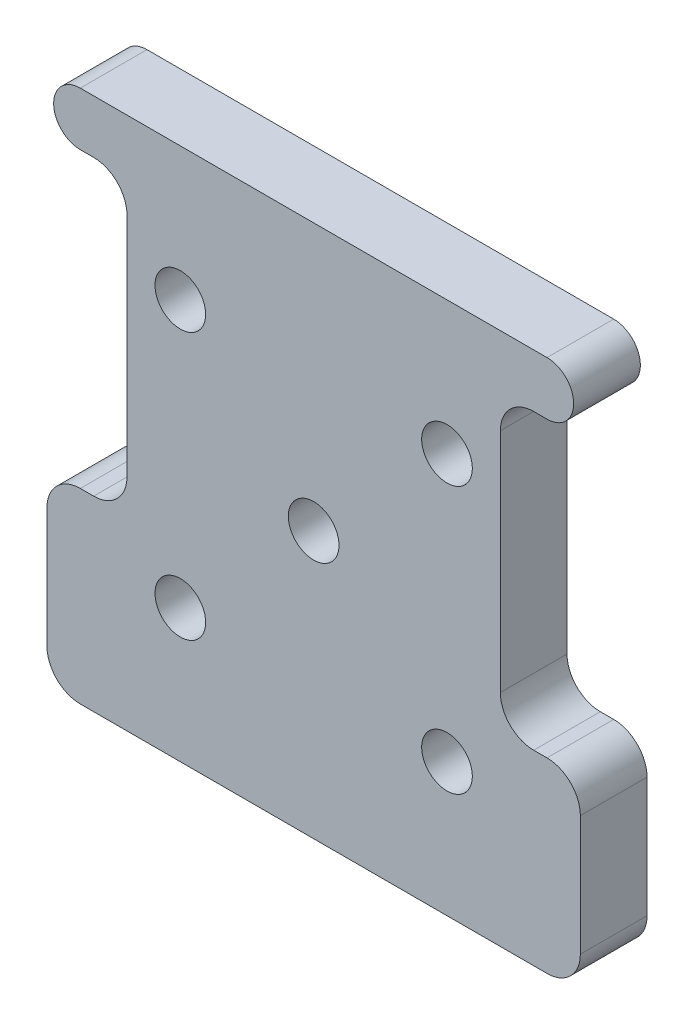
ISO-10303-21;
HEADER;
FILE_DESCRIPTION(('STEP AP214'),'2;1');
FILE_NAME('part.step','',(''),(''),'','','');
FILE_SCHEMA(('AUTOMOTIVE_DESIGN { 1 0 10303 214 1 1 1 1 }'));
ENDSEC;
DATA;
#1=APPLICATION_CONTEXT('core data for automotive mechanical design processes');
#2=APPLICATION_PROTOCOL_DEFINITION('international standard','automotive_design',2000,#1);
#3=PRODUCT_CONTEXT('',#1,'mechanical');
#4=PRODUCT('Part','Part','',(#3));
#5=PRODUCT_RELATED_PRODUCT_CATEGORY('part','',(#4));
#6=PRODUCT_DEFINITION_FORMATION('','',#4);
#7=PRODUCT_DEFINITION_CONTEXT('part definition',#1,'design');
#8=PRODUCT_DEFINITION('design','',#6,#7);
#9=PRODUCT_DEFINITION_SHAPE('','',#8);
#10=(LENGTH_UNIT() NAMED_UNIT(*) SI_UNIT(.MILLI.,.METRE.));
#11=(NAMED_UNIT(*) PLANE_ANGLE_UNIT() SI_UNIT($,.RADIAN.));
#12=(NAMED_UNIT(*) SI_UNIT($,.STERADIAN.) SOLID_ANGLE_UNIT());
#13=UNCERTAINTY_MEASURE_WITH_UNIT(LENGTH_MEASURE(1.E-05),#10,'distance_accuracy_value','');
#14=(GEOMETRIC_REPRESENTATION_CONTEXT(3) GLOBAL_UNCERTAINTY_ASSIGNED_CONTEXT((#13)) GLOBAL_UNIT_ASSIGNED_CONTEXT((#10,
#11,#12)) REPRESENTATION_CONTEXT('',''));
#15=CARTESIAN_POINT('',(0.,0.,0.));
#16=DIRECTION('',(0.,0.,1.));
#17=DIRECTION('',(1.,0.,0.));
#18=AXIS2_PLACEMENT_3D('',#15,#16,#17);
#19=CARTESIAN_POINT('',(0.,0.,6.35));
#20=DIRECTION('',(0.,0.,1.));
#21=DIRECTION('',(1.,0.,0.));
#22=AXIS2_PLACEMENT_3D('',#19,#20,#21);
#23=PLANE('',#22);
#24=CARTESIAN_POINT('',(-12.7,38.1,6.35));
#25=DIRECTION('',(0.,0.,1.));
#26=DIRECTION('',(1.,0.,0.));
#27=AXIS2_PLACEMENT_3D('',#24,#25,#26);
#28=CIRCLE('',#27,2.413);
#29=CARTESIAN_POINT('',(-10.287,38.1,6.35));
#30=VERTEX_POINT('',#29);
#31=EDGE_CURVE('E711',#30,#30,#28,.T.);
#32=ORIENTED_EDGE('',*,*,#31,.F.);
#33=EDGE_LOOP('',(#32));
#34=FACE_BOUND('',#33,.T.);
#35=CARTESIAN_POINT('',(12.7,12.7,6.35));
#36=DIRECTION('',(0.,0.,1.));
#37=DIRECTION('',(1.,0.,0.));
#38=AXIS2_PLACEMENT_3D('',#35,#36,#37);
#39=CIRCLE('',#38,2.413);
#40=CARTESIAN_POINT('',(15.113,12.7,6.35));
#41=VERTEX_POINT('',#40);
#42=EDGE_CURVE('E727',#41,#41,#39,.T.);
#43=ORIENTED_EDGE('',*,*,#42,.F.);
#44=EDGE_LOOP('',(#43));
#45=FACE_BOUND('',#44,.T.);
#46=DIRECTION('',(-1.,0.,0.));
#47=VECTOR('',#46,1.);
#48=CARTESIAN_POINT('',(25.4,50.8,6.35));
#49=LINE('',#48,#47);
#50=CARTESIAN_POINT('',(22.225,50.8,6.35));
#51=VERTEX_POINT('',#50);
#52=CARTESIAN_POINT('',(-22.2250000000001,50.8,6.35));
#53=VERTEX_POINT('',#52);
#54=EDGE_CURVE('E368',#51,#53,#49,.T.);
#55=ORIENTED_EDGE('',*,*,#54,.T.);
#56=CARTESIAN_POINT('',(-22.2250000000002,48.26,6.35));
#57=DIRECTION('',(0.,0.,1.));
#58=DIRECTION('',(1.,0.,0.));
#59=AXIS2_PLACEMENT_3D('',#56,#57,#58);
#60=CIRCLE('',#59,2.54);
#61=CARTESIAN_POINT('',(-22.2250000000002,45.72,6.35));
#62=VERTEX_POINT('',#61);
#63=EDGE_CURVE('E11',#53,#62,#60,.T.);
#64=ORIENTED_EDGE('',*,*,#63,.T.);
#65=DIRECTION('',(1.,0.,0.));
#66=VECTOR('',#65,1.);
#67=CARTESIAN_POINT('',(-17.78,45.72,6.35));
#68=LINE('',#67,#66);
#69=CARTESIAN_POINT('',(-20.955,45.72,6.35));
#70=VERTEX_POINT('',#69);
#71=EDGE_CURVE('E380',#62,#70,#68,.T.);
#72=ORIENTED_EDGE('',*,*,#71,.T.);
#73=CARTESIAN_POINT('',(-20.955,42.545,6.35));
#74=DIRECTION('',(0.,0.,1.));
#75=DIRECTION('',(1.,0.,0.));
#76=AXIS2_PLACEMENT_3D('',#73,#74,#75);
#77=CIRCLE('',#76,3.175);
#78=CARTESIAN_POINT('',(-17.78,42.545,6.35));
#79=VERTEX_POINT('',#78);
#80=EDGE_CURVE('E342',#70,#79,#77,.F.);
#81=ORIENTED_EDGE('',*,*,#80,.T.);
#82=DIRECTION('',(0.,-1.,0.));
#83=VECTOR('',#82,1.);
#84=CARTESIAN_POINT('',(-17.78,17.78,6.35));
#85=LINE('',#84,#83);
#86=CARTESIAN_POINT('',(-17.78,20.955,6.35));
#87=VERTEX_POINT('',#86);
#88=EDGE_CURVE('E424',#79,#87,#85,.T.);
#89=ORIENTED_EDGE('',*,*,#88,.T.);
#90=CARTESIAN_POINT('',(-20.955,20.955,6.35));
#91=DIRECTION('',(0.,0.,1.));
#92=DIRECTION('',(1.,0.,0.));
#93=AXIS2_PLACEMENT_3D('',#90,#91,#92);
#94=CIRCLE('',#93,3.175);
#95=CARTESIAN_POINT('',(-20.955,17.78,6.35));
#96=VERTEX_POINT('',#95);
#97=EDGE_CURVE('E336',#87,#96,#94,.F.);
#98=ORIENTED_EDGE('',*,*,#97,.T.);
#99=DIRECTION('',(-1.,0.,0.));
#100=VECTOR('',#99,1.);
#101=CARTESIAN_POINT('',(-25.4,17.78,6.35));
#102=LINE('',#101,#100);
#103=CARTESIAN_POINT('',(-22.225,17.78,6.35));
#104=VERTEX_POINT('',#103);
#105=EDGE_CURVE('E428',#96,#104,#102,.T.);
#106=ORIENTED_EDGE('',*,*,#105,.T.);
#107=CARTESIAN_POINT('',(-22.225,14.605,6.35));
#108=DIRECTION('',(0.,0.,1.));
#109=DIRECTION('',(1.,0.,0.));
#110=AXIS2_PLACEMENT_3D('',#107,#108,#109);
#111=CIRCLE('',#110,3.175);
#112=CARTESIAN_POINT('',(-25.4,14.605,6.35));
#113=VERTEX_POINT('',#112);
#114=EDGE_CURVE('E62',#104,#113,#111,.T.);
#115=ORIENTED_EDGE('',*,*,#114,.T.);
#116=DIRECTION('',(0.,-1.,0.));
#117=VECTOR('',#116,1.);
#118=CARTESIAN_POINT('',(-25.4,-2.22044604925031E-13,6.35));
#119=LINE('',#118,#117);
#120=CARTESIAN_POINT('',(-25.4,3.17499999999979,6.35));
#121=VERTEX_POINT('',#120);
#122=EDGE_CURVE('E430',#113,#121,#119,.T.);
#123=ORIENTED_EDGE('',*,*,#122,.T.);
#124=CARTESIAN_POINT('',(-22.225,3.17499999999979,6.35));
#125=DIRECTION('',(0.,0.,1.));
#126=DIRECTION('',(1.,0.,0.));
#127=AXIS2_PLACEMENT_3D('',#124,#125,#126);
#128=CIRCLE('',#127,3.175);
#129=CARTESIAN_POINT('',(-22.225,-2.08166817117217E-13,6.35));
#130=VERTEX_POINT('',#129);
#131=EDGE_CURVE('E272',#121,#130,#128,.T.);
#132=ORIENTED_EDGE('',*,*,#131,.T.);
#133=DIRECTION('',(1.,0.,0.));
#134=VECTOR('',#133,1.);
#135=CARTESIAN_POINT('',(-25.4,-2.22044604925031E-13,6.35));
#136=LINE('',#135,#134);
#137=CARTESIAN_POINT('',(22.225,0.,6.35));
#138=VERTEX_POINT('',#137);
#139=EDGE_CURVE('E221',#130,#138,#136,.T.);
#140=ORIENTED_EDGE('',*,*,#139,.T.);
#141=CARTESIAN_POINT('',(22.225,3.17499999999999,6.35));
#142=DIRECTION('',(0.,0.,1.));
#143=DIRECTION('',(1.,0.,0.));
#144=AXIS2_PLACEMENT_3D('',#141,#142,#143);
#145=CIRCLE('',#144,3.175);
#146=CARTESIAN_POINT('',(25.4,3.17499999999999,6.35));
#147=VERTEX_POINT('',#146);
#148=EDGE_CURVE('E275',#138,#147,#145,.T.);
#149=ORIENTED_EDGE('',*,*,#148,.T.);
#150=DIRECTION('',(0.,1.,0.));
#151=VECTOR('',#150,1.);
#152=CARTESIAN_POINT('',(25.4,0.,6.35));
#153=LINE('',#152,#151);
#154=CARTESIAN_POINT('',(25.4,14.605,6.35));
#155=VERTEX_POINT('',#154);
#156=EDGE_CURVE('E199',#147,#155,#153,.T.);
#157=ORIENTED_EDGE('',*,*,#156,.T.);
#158=CARTESIAN_POINT('',(22.225,14.605,6.35));
#159=DIRECTION('',(0.,0.,1.));
#160=DIRECTION('',(1.,0.,0.));
#161=AXIS2_PLACEMENT_3D('',#158,#159,#160);
#162=CIRCLE('',#161,3.175);
#163=CARTESIAN_POINT('',(22.225,17.78,6.35));
#164=VERTEX_POINT('',#163);
#165=EDGE_CURVE('E267',#155,#164,#162,.T.);
#166=ORIENTED_EDGE('',*,*,#165,.T.);
#167=DIRECTION('',(-1.,0.,0.));
#168=VECTOR('',#167,1.);
#169=CARTESIAN_POINT('',(25.4,17.78,6.35));
#170=LINE('',#169,#168);
#171=CARTESIAN_POINT('',(20.955,17.78,6.35));
#172=VERTEX_POINT('',#171);
#173=EDGE_CURVE('E406',#164,#172,#170,.T.);
#174=ORIENTED_EDGE('',*,*,#173,.T.);
#175=CARTESIAN_POINT('',(20.955,20.955,6.35));
#176=DIRECTION('',(0.,0.,1.));
#177=DIRECTION('',(1.,0.,0.));
#178=AXIS2_PLACEMENT_3D('',#175,#176,#177);
#179=CIRCLE('',#178,3.175);
#180=CARTESIAN_POINT('',(17.78,20.955,6.35));
#181=VERTEX_POINT('',#180);
#182=EDGE_CURVE('E354',#172,#181,#179,.F.);
#183=ORIENTED_EDGE('',*,*,#182,.T.);
#184=DIRECTION('',(0.,1.,0.));
#185=VECTOR('',#184,1.);
#186=CARTESIAN_POINT('',(17.78,17.78,6.35));
#187=LINE('',#186,#185);
#188=CARTESIAN_POINT('',(17.78,42.545,6.35));
#189=VERTEX_POINT('',#188);
#190=EDGE_CURVE('E396',#181,#189,#187,.T.);
#191=ORIENTED_EDGE('',*,*,#190,.T.);
#192=CARTESIAN_POINT('',(20.955,42.545,6.35));
#193=DIRECTION('',(0.,0.,1.));
#194=DIRECTION('',(1.,0.,0.));
#195=AXIS2_PLACEMENT_3D('',#192,#193,#194);
#196=CIRCLE('',#195,3.175);
#197=CARTESIAN_POINT('',(20.955,45.72,6.35));
#198=VERTEX_POINT('',#197);
#199=EDGE_CURVE('E348',#189,#198,#196,.F.);
#200=ORIENTED_EDGE('',*,*,#199,.T.);
#201=DIRECTION('',(1.,0.,0.));
#202=VECTOR('',#201,1.);
#203=CARTESIAN_POINT('',(17.78,45.72,6.35));
#204=LINE('',#203,#202);
#205=CARTESIAN_POINT('',(22.225,45.72,6.35));
#206=VERTEX_POINT('',#205);
#207=EDGE_CURVE('E371',#198,#206,#204,.T.);
#208=ORIENTED_EDGE('',*,*,#207,.T.);
#209=CARTESIAN_POINT('',(22.225,48.26,6.35));
#210=DIRECTION('',(0.,0.,1.));
#211=DIRECTION('',(1.,0.,0.));
#212=AXIS2_PLACEMENT_3D('',#209,#210,#211);
#213=CIRCLE('',#212,2.54);
#214=EDGE_CURVE('E48',#206,#51,#213,.T.);
#215=ORIENTED_EDGE('',*,*,#214,.T.);
#216=EDGE_LOOP('',(#55,#64,#72,#81,#89,#98,#106,#115,#123,#132,#140,#149,#157,#166,#174,#183,
#191,#200,#208,#215));
#217=FACE_BOUND('',#216,.T.);
#218=CARTESIAN_POINT('',(-12.7,12.7,6.35));
#219=DIRECTION('',(0.,0.,1.));
#220=DIRECTION('',(1.,0.,0.));
#221=AXIS2_PLACEMENT_3D('',#218,#219,#220);
#222=CIRCLE('',#221,2.413);
#223=CARTESIAN_POINT('',(-10.287,12.7,6.35));
#224=VERTEX_POINT('',#223);
#225=EDGE_CURVE('E210',#224,#224,#222,.T.);
#226=ORIENTED_EDGE('',*,*,#225,.F.);
#227=EDGE_LOOP('',(#226));
#228=FACE_BOUND('',#227,.T.);
#229=CARTESIAN_POINT('',(0.,25.4,6.35));
#230=DIRECTION('',(0.,0.,1.));
#231=DIRECTION('',(1.,0.,0.));
#232=AXIS2_PLACEMENT_3D('',#229,#230,#231);
#233=CIRCLE('',#232,2.413);
#234=CARTESIAN_POINT('',(2.413,25.4,6.35));
#235=VERTEX_POINT('',#234);
#236=EDGE_CURVE('E719',#235,#235,#233,.T.);
#237=ORIENTED_EDGE('',*,*,#236,.F.);
#238=EDGE_LOOP('',(#237));
#239=FACE_BOUND('',#238,.T.);
#240=CARTESIAN_POINT('',(12.7,38.1,6.35));
#241=DIRECTION('',(0.,0.,1.));
#242=DIRECTION('',(1.,0.,0.));
#243=AXIS2_PLACEMENT_3D('',#240,#241,#242);
#244=CIRCLE('',#243,2.413);
#245=CARTESIAN_POINT('',(15.113,38.1,6.35));
#246=VERTEX_POINT('',#245);
#247=EDGE_CURVE('E700',#246,#246,#244,.T.);
#248=ORIENTED_EDGE('',*,*,#247,.F.);
#249=EDGE_LOOP('',(#248));
#250=FACE_BOUND('',#249,.T.);
#251=ADVANCED_FACE('F39',(#34,#45,#217,#228,#239,#250),#23,.T.);
#252=CARTESIAN_POINT('',(0.,0.,0.));
#253=DIRECTION('',(0.,0.,1.));
#254=DIRECTION('',(1.,0.,0.));
#255=AXIS2_PLACEMENT_3D('',#252,#253,#254);
#256=PLANE('',#255);
#257=DIRECTION('',(1.,0.,0.));
#258=VECTOR('',#257,1.);
#259=CARTESIAN_POINT('',(-17.78,45.72,0.));
#260=LINE('',#259,#258);
#261=CARTESIAN_POINT('',(-22.2250000000002,45.72,0.));
#262=VERTEX_POINT('',#261);
#263=CARTESIAN_POINT('',(-20.955,45.72,0.));
#264=VERTEX_POINT('',#263);
#265=EDGE_CURVE('E235',#262,#264,#260,.T.);
#266=ORIENTED_EDGE('',*,*,#265,.F.);
#267=CARTESIAN_POINT('',(-22.2250000000002,48.26,0.));
#268=DIRECTION('',(0.,0.,1.));
#269=DIRECTION('',(1.,0.,0.));
#270=AXIS2_PLACEMENT_3D('',#267,#268,#269);
#271=CIRCLE('',#270,2.54);
#272=CARTESIAN_POINT('',(-22.2250000000001,50.8,0.));
#273=VERTEX_POINT('',#272);
#274=EDGE_CURVE('E360',#262,#273,#271,.F.);
#275=ORIENTED_EDGE('',*,*,#274,.T.);
#276=DIRECTION('',(-1.,0.,0.));
#277=VECTOR('',#276,1.);
#278=CARTESIAN_POINT('',(25.4,50.8,0.));
#279=LINE('',#278,#277);
#280=CARTESIAN_POINT('',(22.225,50.8,0.));
#281=VERTEX_POINT('',#280);
#282=EDGE_CURVE('E231',#281,#273,#279,.T.);
#283=ORIENTED_EDGE('',*,*,#282,.F.);
#284=CARTESIAN_POINT('',(22.225,48.26,0.));
#285=DIRECTION('',(0.,0.,1.));
#286=DIRECTION('',(1.,0.,0.));
#287=AXIS2_PLACEMENT_3D('',#284,#285,#286);
#288=CIRCLE('',#287,2.54);
#289=CARTESIAN_POINT('',(22.225,45.72,0.));
#290=VERTEX_POINT('',#289);
#291=EDGE_CURVE('E357',#281,#290,#288,.F.);
#292=ORIENTED_EDGE('',*,*,#291,.T.);
#293=DIRECTION('',(1.,0.,0.));
#294=VECTOR('',#293,1.);
#295=CARTESIAN_POINT('',(17.78,45.72,0.));
#296=LINE('',#295,#294);
#297=CARTESIAN_POINT('',(20.955,45.72,0.));
#298=VERTEX_POINT('',#297);
#299=EDGE_CURVE('E227',#298,#290,#296,.T.);
#300=ORIENTED_EDGE('',*,*,#299,.F.);
#301=CARTESIAN_POINT('',(20.955,42.545,0.));
#302=DIRECTION('',(0.,0.,1.));
#303=DIRECTION('',(1.,0.,0.));
#304=AXIS2_PLACEMENT_3D('',#301,#302,#303);
#305=CIRCLE('',#304,3.175);
#306=CARTESIAN_POINT('',(17.78,42.545,0.));
#307=VERTEX_POINT('',#306);
#308=EDGE_CURVE('E345',#298,#307,#305,.T.);
#309=ORIENTED_EDGE('',*,*,#308,.T.);
#310=DIRECTION('',(0.,1.,0.));
#311=VECTOR('',#310,1.);
#312=CARTESIAN_POINT('',(17.78,17.78,0.));
#313=LINE('',#312,#311);
#314=CARTESIAN_POINT('',(17.78,20.955,0.));
#315=VERTEX_POINT('',#314);
#316=EDGE_CURVE('E215',#315,#307,#313,.T.);
#317=ORIENTED_EDGE('',*,*,#316,.F.);
#318=CARTESIAN_POINT('',(20.955,20.955,0.));
#319=DIRECTION('',(0.,0.,1.));
#320=DIRECTION('',(1.,0.,0.));
#321=AXIS2_PLACEMENT_3D('',#318,#319,#320);
#322=CIRCLE('',#321,3.175);
#323=CARTESIAN_POINT('',(20.955,17.78,0.));
#324=VERTEX_POINT('',#323);
#325=EDGE_CURVE('E351',#315,#324,#322,.T.);
#326=ORIENTED_EDGE('',*,*,#325,.T.);
#327=DIRECTION('',(-1.,0.,0.));
#328=VECTOR('',#327,1.);
#329=CARTESIAN_POINT('',(25.4,17.78,0.));
#330=LINE('',#329,#328);
#331=CARTESIAN_POINT('',(22.225,17.78,0.));
#332=VERTEX_POINT('',#331);
#333=EDGE_CURVE('E209',#332,#324,#330,.T.);
#334=ORIENTED_EDGE('',*,*,#333,.F.);
#335=CARTESIAN_POINT('',(22.225,14.605,0.));
#336=DIRECTION('',(0.,0.,1.));
#337=DIRECTION('',(1.,0.,0.));
#338=AXIS2_PLACEMENT_3D('',#335,#336,#337);
#339=CIRCLE('',#338,3.175);
#340=CARTESIAN_POINT('',(25.4,14.605,0.));
#341=VERTEX_POINT('',#340);
#342=EDGE_CURVE('E201',#332,#341,#339,.F.);
#343=ORIENTED_EDGE('',*,*,#342,.T.);
#344=DIRECTION('',(0.,1.,0.));
#345=VECTOR('',#344,1.);
#346=CARTESIAN_POINT('',(25.4,0.,0.));
#347=LINE('',#346,#345);
#348=CARTESIAN_POINT('',(25.4,3.17499999999999,0.));
#349=VERTEX_POINT('',#348);
#350=EDGE_CURVE('E196',#349,#341,#347,.T.);
#351=ORIENTED_EDGE('',*,*,#350,.F.);
#352=CARTESIAN_POINT('',(22.225,3.17499999999999,0.));
#353=DIRECTION('',(0.,0.,1.));
#354=DIRECTION('',(1.,0.,0.));
#355=AXIS2_PLACEMENT_3D('',#352,#353,#354);
#356=CIRCLE('',#355,3.175);
#357=CARTESIAN_POINT('',(22.225,0.,0.));
#358=VERTEX_POINT('',#357);
#359=EDGE_CURVE('E178',#349,#358,#356,.F.);
#360=ORIENTED_EDGE('',*,*,#359,.T.);
#361=DIRECTION('',(1.,0.,0.));
#362=VECTOR('',#361,1.);
#363=CARTESIAN_POINT('',(-25.4,-2.22044604925031E-13,0.));
#364=LINE('',#363,#362);
#365=CARTESIAN_POINT('',(-22.225,-2.08166817117217E-13,0.));
#366=VERTEX_POINT('',#365);
#367=EDGE_CURVE('E250',#366,#358,#364,.T.);
#368=ORIENTED_EDGE('',*,*,#367,.F.);
#369=CARTESIAN_POINT('',(-22.225,3.17499999999979,0.));
#370=DIRECTION('',(0.,0.,1.));
#371=DIRECTION('',(1.,0.,0.));
#372=AXIS2_PLACEMENT_3D('',#369,#370,#371);
#373=CIRCLE('',#372,3.175);
#374=CARTESIAN_POINT('',(-25.4,3.17499999999979,0.));
#375=VERTEX_POINT('',#374);
#376=EDGE_CURVE('E190',#366,#375,#373,.F.);
#377=ORIENTED_EDGE('',*,*,#376,.T.);
#378=DIRECTION('',(0.,-1.,0.));
#379=VECTOR('',#378,1.);
#380=CARTESIAN_POINT('',(-25.4,-2.22044604925031E-13,0.));
#381=LINE('',#380,#379);
#382=CARTESIAN_POINT('',(-25.4,14.605,0.));
#383=VERTEX_POINT('',#382);
#384=EDGE_CURVE('E247',#383,#375,#381,.T.);
#385=ORIENTED_EDGE('',*,*,#384,.F.);
#386=CARTESIAN_POINT('',(-22.225,14.605,0.));
#387=DIRECTION('',(0.,0.,1.));
#388=DIRECTION('',(1.,0.,0.));
#389=AXIS2_PLACEMENT_3D('',#386,#387,#388);
#390=CIRCLE('',#389,3.175);
#391=CARTESIAN_POINT('',(-22.225,17.78,0.));
#392=VERTEX_POINT('',#391);
#393=EDGE_CURVE('E257',#383,#392,#390,.F.);
#394=ORIENTED_EDGE('',*,*,#393,.T.);
#395=DIRECTION('',(-1.,0.,0.));
#396=VECTOR('',#395,1.);
#397=CARTESIAN_POINT('',(-25.4,17.78,0.));
#398=LINE('',#397,#396);
#399=CARTESIAN_POINT('',(-20.955,17.78,0.));
#400=VERTEX_POINT('',#399);
#401=EDGE_CURVE('E243',#400,#392,#398,.T.);
#402=ORIENTED_EDGE('',*,*,#401,.F.);
#403=CARTESIAN_POINT('',(-20.955,20.955,0.));
#404=DIRECTION('',(0.,0.,1.));
#405=DIRECTION('',(1.,0.,0.));
#406=AXIS2_PLACEMENT_3D('',#403,#404,#405);
#407=CIRCLE('',#406,3.175);
#408=CARTESIAN_POINT('',(-17.78,20.955,0.));
#409=VERTEX_POINT('',#408);
#410=EDGE_CURVE('E333',#400,#409,#407,.T.);
#411=ORIENTED_EDGE('',*,*,#410,.T.);
#412=DIRECTION('',(0.,-1.,0.));
#413=VECTOR('',#412,1.);
#414=CARTESIAN_POINT('',(-17.78,17.78,0.));
#415=LINE('',#414,#413);
#416=CARTESIAN_POINT('',(-17.78,42.545,0.));
#417=VERTEX_POINT('',#416);
#418=EDGE_CURVE('E239',#417,#409,#415,.T.);
#419=ORIENTED_EDGE('',*,*,#418,.F.);
#420=CARTESIAN_POINT('',(-20.955,42.545,0.));
#421=DIRECTION('',(0.,0.,1.));
#422=DIRECTION('',(1.,0.,0.));
#423=AXIS2_PLACEMENT_3D('',#420,#421,#422);
#424=CIRCLE('',#423,3.175);
#425=EDGE_CURVE('E339',#417,#264,#424,.T.);
#426=ORIENTED_EDGE('',*,*,#425,.T.);
#427=EDGE_LOOP('',(#266,#275,#283,#292,#300,#309,#317,#326,#334,#343,#351,#360,#368,#377,#385,
#394,#402,#411,#419,#426));
#428=FACE_BOUND('',#427,.T.);
#429=CARTESIAN_POINT('',(-12.7,12.7,0.));
#430=DIRECTION('',(0.,0.,1.));
#431=DIRECTION('',(1.,0.,0.));
#432=AXIS2_PLACEMENT_3D('',#429,#430,#431);
#433=CIRCLE('',#432,2.413);
#434=CARTESIAN_POINT('',(-10.287,12.7,0.));
#435=VERTEX_POINT('',#434);
#436=EDGE_CURVE('E218',#435,#435,#433,.T.);
#437=ORIENTED_EDGE('',*,*,#436,.T.);
#438=EDGE_LOOP('',(#437));
#439=FACE_BOUND('',#438,.T.);
#440=CARTESIAN_POINT('',(12.7,12.7,0.));
#441=DIRECTION('',(0.,0.,1.));
#442=DIRECTION('',(1.,0.,0.));
#443=AXIS2_PLACEMENT_3D('',#440,#441,#442);
#444=CIRCLE('',#443,2.413);
#445=CARTESIAN_POINT('',(15.113,12.7,0.));
#446=VERTEX_POINT('',#445);
#447=EDGE_CURVE('E723',#446,#446,#444,.T.);
#448=ORIENTED_EDGE('',*,*,#447,.T.);
#449=EDGE_LOOP('',(#448));
#450=FACE_BOUND('',#449,.T.);
#451=CARTESIAN_POINT('',(0.,25.4,0.));
#452=DIRECTION('',(0.,0.,1.));
#453=DIRECTION('',(1.,0.,0.));
#454=AXIS2_PLACEMENT_3D('',#451,#452,#453);
#455=CIRCLE('',#454,2.413);
#456=CARTESIAN_POINT('',(2.413,25.4,0.));
#457=VERTEX_POINT('',#456);
#458=EDGE_CURVE('E715',#457,#457,#455,.T.);
#459=ORIENTED_EDGE('',*,*,#458,.T.);
#460=EDGE_LOOP('',(#459));
#461=FACE_BOUND('',#460,.T.);
#462=CARTESIAN_POINT('',(-12.7,38.1,0.));
#463=DIRECTION('',(0.,0.,1.));
#464=DIRECTION('',(1.,0.,0.));
#465=AXIS2_PLACEMENT_3D('',#462,#463,#464);
#466=CIRCLE('',#465,2.413);
#467=CARTESIAN_POINT('',(-10.287,38.1,0.));
#468=VERTEX_POINT('',#467);
#469=EDGE_CURVE('E708',#468,#468,#466,.T.);
#470=ORIENTED_EDGE('',*,*,#469,.T.);
#471=EDGE_LOOP('',(#470));
#472=FACE_BOUND('',#471,.T.);
#473=CARTESIAN_POINT('',(12.7,38.1,0.));
#474=DIRECTION('',(0.,0.,1.));
#475=DIRECTION('',(1.,0.,0.));
#476=AXIS2_PLACEMENT_3D('',#473,#474,#475);
#477=CIRCLE('',#476,2.413);
#478=CARTESIAN_POINT('',(15.113,38.1,0.));
#479=VERTEX_POINT('',#478);
#480=EDGE_CURVE('E703',#479,#479,#477,.T.);
#481=ORIENTED_EDGE('',*,*,#480,.T.);
#482=EDGE_LOOP('',(#481));
#483=FACE_BOUND('',#482,.T.);
#484=ADVANCED_FACE('F205',(#428,#439,#450,#461,#472,#483),#256,.F.);
#485=CARTESIAN_POINT('',(25.4,0.,6.35));
#486=DIRECTION('',(-1.,0.,0.));
#487=DIRECTION('',(0.,0.,1.));
#488=AXIS2_PLACEMENT_3D('',#485,#486,#487);
#489=PLANE('',#488);
#490=ORIENTED_EDGE('',*,*,#156,.F.);
#491=DIRECTION('',(0.,0.,-1.));
#492=VECTOR('',#491,1.);
#493=CARTESIAN_POINT('',(25.4,3.17499999999999,6.35));
#494=LINE('',#493,#492);
#495=EDGE_CURVE('E182',#147,#349,#494,.T.);
#496=ORIENTED_EDGE('',*,*,#495,.T.);
#497=ORIENTED_EDGE('',*,*,#350,.T.);
#498=DIRECTION('',(0.,0.,-1.));
#499=VECTOR('',#498,1.);
#500=CARTESIAN_POINT('',(25.4,14.605,6.35));
#501=LINE('',#500,#499);
#502=EDGE_CURVE('E202',#341,#155,#501,.F.);
#503=ORIENTED_EDGE('',*,*,#502,.T.);
#504=EDGE_LOOP('',(#490,#496,#497,#503));
#505=FACE_BOUND('',#504,.T.);
#506=ADVANCED_FACE('F195',(#505),#489,.F.);
#507=CARTESIAN_POINT('',(25.4,17.78,6.35));
#508=DIRECTION('',(0.,-1.,0.));
#509=DIRECTION('',(0.,0.,-1.));
#510=AXIS2_PLACEMENT_3D('',#507,#508,#509);
#511=PLANE('',#510);
#512=ORIENTED_EDGE('',*,*,#333,.T.);
#513=DIRECTION('',(0.,0.,-1.));
#514=VECTOR('',#513,1.);
#515=CARTESIAN_POINT('',(20.955,17.78,6.35));
#516=LINE('',#515,#514);
#517=EDGE_CURVE('E330',#324,#172,#516,.F.);
#518=ORIENTED_EDGE('',*,*,#517,.T.);
#519=ORIENTED_EDGE('',*,*,#173,.F.);
#520=DIRECTION('',(0.,0.,-1.));
#521=VECTOR('',#520,1.);
#522=CARTESIAN_POINT('',(22.225,17.78,6.35));
#523=LINE('',#522,#521);
#524=EDGE_CURVE('E326',#164,#332,#523,.T.);
#525=ORIENTED_EDGE('',*,*,#524,.T.);
#526=EDGE_LOOP('',(#512,#518,#519,#525));
#527=FACE_BOUND('',#526,.T.);
#528=ADVANCED_FACE('F402',(#527),#511,.F.);
#529=CARTESIAN_POINT('',(17.78,17.78,6.35));
#530=DIRECTION('',(-1.,0.,0.));
#531=DIRECTION('',(0.,0.,1.));
#532=AXIS2_PLACEMENT_3D('',#529,#530,#531);
#533=PLANE('',#532);
#534=ORIENTED_EDGE('',*,*,#316,.T.);
#535=DIRECTION('',(0.,0.,-1.));
#536=VECTOR('',#535,1.);
#537=CARTESIAN_POINT('',(17.78,42.545,6.35));
#538=LINE('',#537,#536);
#539=EDGE_CURVE('E323',#307,#189,#538,.F.);
#540=ORIENTED_EDGE('',*,*,#539,.T.);
#541=ORIENTED_EDGE('',*,*,#190,.F.);
#542=DIRECTION('',(0.,0.,-1.));
#543=VECTOR('',#542,1.);
#544=CARTESIAN_POINT('',(17.78,20.955,0.));
#545=LINE('',#544,#543);
#546=EDGE_CURVE('E319',#181,#315,#545,.T.);
#547=ORIENTED_EDGE('',*,*,#546,.T.);
#548=EDGE_LOOP('',(#534,#540,#541,#547));
#549=FACE_BOUND('',#548,.T.);
#550=ADVANCED_FACE('F392',(#549),#533,.F.);
#551=CARTESIAN_POINT('',(17.78,45.72,6.35));
#552=DIRECTION('',(0.,1.,0.));
#553=DIRECTION('',(0.,0.,1.));
#554=AXIS2_PLACEMENT_3D('',#551,#552,#553);
#555=PLANE('',#554);
#556=ORIENTED_EDGE('',*,*,#299,.T.);
#557=DIRECTION('',(0.,0.,-1.));
#558=VECTOR('',#557,1.);
#559=CARTESIAN_POINT('',(22.225,45.72,6.35));
#560=LINE('',#559,#558);
#561=EDGE_CURVE('E316',#290,#206,#560,.F.);
#562=ORIENTED_EDGE('',*,*,#561,.T.);
#563=ORIENTED_EDGE('',*,*,#207,.F.);
#564=DIRECTION('',(0.,0.,-1.));
#565=VECTOR('',#564,1.);
#566=CARTESIAN_POINT('',(20.955,45.72,0.));
#567=LINE('',#566,#565);
#568=EDGE_CURVE('E312',#198,#298,#567,.T.);
#569=ORIENTED_EDGE('',*,*,#568,.T.);
#570=EDGE_LOOP('',(#556,#562,#563,#569));
#571=FACE_BOUND('',#570,.T.);
#572=ADVANCED_FACE('F384',(#571),#555,.F.);
#573=CARTESIAN_POINT('',(25.4,50.8,6.35));
#574=DIRECTION('',(0.,-1.,0.));
#575=DIRECTION('',(0.,0.,-1.));
#576=AXIS2_PLACEMENT_3D('',#573,#574,#575);
#577=PLANE('',#576);
#578=ORIENTED_EDGE('',*,*,#54,.F.);
#579=DIRECTION('',(0.,0.,-1.));
#580=VECTOR('',#579,1.);
#581=CARTESIAN_POINT('',(22.225,50.8,6.35));
#582=LINE('',#581,#580);
#583=EDGE_CURVE('E308',#51,#281,#582,.T.);
#584=ORIENTED_EDGE('',*,*,#583,.T.);
#585=ORIENTED_EDGE('',*,*,#282,.T.);
#586=DIRECTION('',(0.,0.,-1.));
#587=VECTOR('',#586,1.);
#588=CARTESIAN_POINT('',(-22.2250000000001,50.8,6.35));
#589=LINE('',#588,#587);
#590=EDGE_CURVE('E305',#273,#53,#589,.F.);
#591=ORIENTED_EDGE('',*,*,#590,.T.);
#592=EDGE_LOOP('',(#578,#584,#585,#591));
#593=FACE_BOUND('',#592,.T.);
#594=ADVANCED_FACE('F376',(#593),#577,.F.);
#595=CARTESIAN_POINT('',(-17.78,45.72,6.35));
#596=DIRECTION('',(0.,1.,0.));
#597=DIRECTION('',(0.,0.,1.));
#598=AXIS2_PLACEMENT_3D('',#595,#596,#597);
#599=PLANE('',#598);
#600=ORIENTED_EDGE('',*,*,#265,.T.);
#601=DIRECTION('',(0.,0.,-1.));
#602=VECTOR('',#601,1.);
#603=CARTESIAN_POINT('',(-20.955,45.72,6.35));
#604=LINE('',#603,#602);
#605=EDGE_CURVE('E302',#264,#70,#604,.F.);
#606=ORIENTED_EDGE('',*,*,#605,.T.);
#607=ORIENTED_EDGE('',*,*,#71,.F.);
#608=DIRECTION('',(0.,0.,-1.));
#609=VECTOR('',#608,1.);
#610=CARTESIAN_POINT('',(-22.2250000000002,45.72,6.35));
#611=LINE('',#610,#609);
#612=EDGE_CURVE('E298',#62,#262,#611,.T.);
#613=ORIENTED_EDGE('',*,*,#612,.T.);
#614=EDGE_LOOP('',(#600,#606,#607,#613));
#615=FACE_BOUND('',#614,.T.);
#616=ADVANCED_FACE('F465',(#615),#599,.F.);
#617=CARTESIAN_POINT('',(-17.78,17.78,6.35));
#618=DIRECTION('',(1.,0.,0.));
#619=DIRECTION('',(0.,0.,-1.));
#620=AXIS2_PLACEMENT_3D('',#617,#618,#619);
#621=PLANE('',#620);
#622=ORIENTED_EDGE('',*,*,#418,.T.);
#623=DIRECTION('',(0.,0.,-1.));
#624=VECTOR('',#623,1.);
#625=CARTESIAN_POINT('',(-17.78,20.955,6.35));
#626=LINE('',#625,#624);
#627=EDGE_CURVE('E295',#409,#87,#626,.F.);
#628=ORIENTED_EDGE('',*,*,#627,.T.);
#629=ORIENTED_EDGE('',*,*,#88,.F.);
#630=DIRECTION('',(0.,0.,-1.));
#631=VECTOR('',#630,1.);
#632=CARTESIAN_POINT('',(-17.78,42.545,0.));
#633=LINE('',#632,#631);
#634=EDGE_CURVE('E291',#79,#417,#633,.T.);
#635=ORIENTED_EDGE('',*,*,#634,.T.);
#636=EDGE_LOOP('',(#622,#628,#629,#635));
#637=FACE_BOUND('',#636,.T.);
#638=ADVANCED_FACE('F457',(#637),#621,.F.);
#639=CARTESIAN_POINT('',(-25.4,17.78,6.35));
#640=DIRECTION('',(0.,-1.,0.));
#641=DIRECTION('',(0.,0.,-1.));
#642=AXIS2_PLACEMENT_3D('',#639,#640,#641);
#643=PLANE('',#642);
#644=ORIENTED_EDGE('',*,*,#401,.T.);
#645=DIRECTION('',(0.,0.,-1.));
#646=VECTOR('',#645,1.);
#647=CARTESIAN_POINT('',(-22.225,17.78,6.35));
#648=LINE('',#647,#646);
#649=EDGE_CURVE('E288',#392,#104,#648,.F.);
#650=ORIENTED_EDGE('',*,*,#649,.T.);
#651=ORIENTED_EDGE('',*,*,#105,.F.);
#652=DIRECTION('',(0.,0.,-1.));
#653=VECTOR('',#652,1.);
#654=CARTESIAN_POINT('',(-20.955,17.78,0.));
#655=LINE('',#654,#653);
#656=EDGE_CURVE('E284',#96,#400,#655,.T.);
#657=ORIENTED_EDGE('',*,*,#656,.T.);
#658=EDGE_LOOP('',(#644,#650,#651,#657));
#659=FACE_BOUND('',#658,.T.);
#660=ADVANCED_FACE('F448',(#659),#643,.F.);
#661=CARTESIAN_POINT('',(-25.4,-2.22044604925031E-13,6.35));
#662=DIRECTION('',(1.,0.,0.));
#663=DIRECTION('',(0.,0.,-1.));
#664=AXIS2_PLACEMENT_3D('',#661,#662,#663);
#665=PLANE('',#664);
#666=ORIENTED_EDGE('',*,*,#384,.T.);
#667=DIRECTION('',(0.,0.,-1.));
#668=VECTOR('',#667,1.);
#669=CARTESIAN_POINT('',(-25.4,3.17499999999979,6.35));
#670=LINE('',#669,#668);
#671=EDGE_CURVE('E55',#375,#121,#670,.F.);
#672=ORIENTED_EDGE('',*,*,#671,.T.);
#673=ORIENTED_EDGE('',*,*,#122,.F.);
#674=DIRECTION('',(0.,0.,-1.));
#675=VECTOR('',#674,1.);
#676=CARTESIAN_POINT('',(-25.4,14.605,6.35));
#677=LINE('',#676,#675);
#678=EDGE_CURVE('E278',#113,#383,#677,.T.);
#679=ORIENTED_EDGE('',*,*,#678,.T.);
#680=EDGE_LOOP('',(#666,#672,#673,#679));
#681=FACE_BOUND('',#680,.T.);
#682=ADVANCED_FACE('F441',(#681),#665,.F.);
#683=CARTESIAN_POINT('',(-25.4,-2.22044604925031E-13,6.35));
#684=DIRECTION('',(0.,1.,0.));
#685=DIRECTION('',(-1.,0.,0.));
#686=AXIS2_PLACEMENT_3D('',#683,#684,#685);
#687=PLANE('',#686);
#688=ORIENTED_EDGE('',*,*,#367,.T.);
#689=DIRECTION('',(0.,0.,-1.));
#690=VECTOR('',#689,1.);
#691=CARTESIAN_POINT('',(22.225,0.,6.35));
#692=LINE('',#691,#690);
#693=EDGE_CURVE('E183',#358,#138,#692,.F.);
#694=ORIENTED_EDGE('',*,*,#693,.T.);
#695=ORIENTED_EDGE('',*,*,#139,.F.);
#696=DIRECTION('',(0.,0.,-1.));
#697=VECTOR('',#696,1.);
#698=CARTESIAN_POINT('',(-22.225,-2.08166817117217E-13,6.35));
#699=LINE('',#698,#697);
#700=EDGE_CURVE('E189',#130,#366,#699,.T.);
#701=ORIENTED_EDGE('',*,*,#700,.T.);
#702=EDGE_LOOP('',(#688,#694,#695,#701));
#703=FACE_BOUND('',#702,.T.);
#704=ADVANCED_FACE('F437',(#703),#687,.F.);
#705=CARTESIAN_POINT('',(-12.7,12.7,6.35));
#706=DIRECTION('',(0.,0.,-1.));
#707=DIRECTION('',(-1.,0.,0.));
#708=AXIS2_PLACEMENT_3D('',#705,#706,#707);
#709=CYLINDRICAL_SURFACE('',#708,2.413);
#710=ORIENTED_EDGE('',*,*,#225,.T.);
#711=EDGE_LOOP('',(#710));
#712=FACE_BOUND('',#711,.T.);
#713=ORIENTED_EDGE('',*,*,#436,.F.);
#714=EDGE_LOOP('',(#713));
#715=FACE_BOUND('',#714,.T.);
#716=ADVANCED_FACE('F486',(#712,#715),#709,.F.);
#717=CARTESIAN_POINT('',(12.7,12.7,6.35));
#718=DIRECTION('',(0.,0.,-1.));
#719=DIRECTION('',(-1.,0.,0.));
#720=AXIS2_PLACEMENT_3D('',#717,#718,#719);
#721=CYLINDRICAL_SURFACE('',#720,2.413);
#722=ORIENTED_EDGE('',*,*,#42,.T.);
#723=EDGE_LOOP('',(#722));
#724=FACE_BOUND('',#723,.T.);
#725=ORIENTED_EDGE('',*,*,#447,.F.);
#726=EDGE_LOOP('',(#725));
#727=FACE_BOUND('',#726,.T.);
#728=ADVANCED_FACE('F597',(#724,#727),#721,.F.);
#729=CARTESIAN_POINT('',(0.,25.4,6.35));
#730=DIRECTION('',(0.,0.,-1.));
#731=DIRECTION('',(-1.,0.,0.));
#732=AXIS2_PLACEMENT_3D('',#729,#730,#731);
#733=CYLINDRICAL_SURFACE('',#732,2.413);
#734=ORIENTED_EDGE('',*,*,#236,.T.);
#735=EDGE_LOOP('',(#734));
#736=FACE_BOUND('',#735,.T.);
#737=ORIENTED_EDGE('',*,*,#458,.F.);
#738=EDGE_LOOP('',(#737));
#739=FACE_BOUND('',#738,.T.);
#740=ADVANCED_FACE('F604',(#736,#739),#733,.F.);
#741=CARTESIAN_POINT('',(-12.7,38.1,6.35));
#742=DIRECTION('',(0.,0.,-1.));
#743=DIRECTION('',(-1.,0.,0.));
#744=AXIS2_PLACEMENT_3D('',#741,#742,#743);
#745=CYLINDRICAL_SURFACE('',#744,2.413);
#746=ORIENTED_EDGE('',*,*,#31,.T.);
#747=EDGE_LOOP('',(#746));
#748=FACE_BOUND('',#747,.T.);
#749=ORIENTED_EDGE('',*,*,#469,.F.);
#750=EDGE_LOOP('',(#749));
#751=FACE_BOUND('',#750,.T.);
#752=ADVANCED_FACE('F611',(#748,#751),#745,.F.);
#753=CARTESIAN_POINT('',(12.7,38.1,6.35));
#754=DIRECTION('',(0.,0.,-1.));
#755=DIRECTION('',(-1.,0.,0.));
#756=AXIS2_PLACEMENT_3D('',#753,#754,#755);
#757=CYLINDRICAL_SURFACE('',#756,2.413);
#758=ORIENTED_EDGE('',*,*,#247,.T.);
#759=EDGE_LOOP('',(#758));
#760=FACE_BOUND('',#759,.T.);
#761=ORIENTED_EDGE('',*,*,#480,.F.);
#762=EDGE_LOOP('',(#761));
#763=FACE_BOUND('',#762,.T.);
#764=ADVANCED_FACE('F511',(#760,#763),#757,.F.);
#765=CARTESIAN_POINT('',(22.225,3.17499999999999,6.35));
#766=DIRECTION('',(0.,0.,-1.));
#767=DIRECTION('',(-1.,0.,0.));
#768=AXIS2_PLACEMENT_3D('',#765,#766,#767);
#769=CYLINDRICAL_SURFACE('',#768,3.175);
#770=ORIENTED_EDGE('',*,*,#148,.F.);
#771=ORIENTED_EDGE('',*,*,#693,.F.);
#772=ORIENTED_EDGE('',*,*,#359,.F.);
#773=ORIENTED_EDGE('',*,*,#495,.F.);
#774=EDGE_LOOP('',(#770,#771,#772,#773));
#775=FACE_BOUND('',#774,.T.);
#776=ADVANCED_FACE('F181',(#775),#769,.T.);
#777=CARTESIAN_POINT('',(-22.225,3.17499999999979,6.35));
#778=DIRECTION('',(0.,0.,-1.));
#779=DIRECTION('',(-1.,0.,0.));
#780=AXIS2_PLACEMENT_3D('',#777,#778,#779);
#781=CYLINDRICAL_SURFACE('',#780,3.175);
#782=ORIENTED_EDGE('',*,*,#131,.F.);
#783=ORIENTED_EDGE('',*,*,#671,.F.);
#784=ORIENTED_EDGE('',*,*,#376,.F.);
#785=ORIENTED_EDGE('',*,*,#700,.F.);
#786=EDGE_LOOP('',(#782,#783,#784,#785));
#787=FACE_BOUND('',#786,.T.);
#788=ADVANCED_FACE('F439',(#787),#781,.T.);
#789=CARTESIAN_POINT('',(-22.225,14.605,6.35));
#790=DIRECTION('',(0.,0.,-1.));
#791=DIRECTION('',(-1.,0.,0.));
#792=AXIS2_PLACEMENT_3D('',#789,#790,#791);
#793=CYLINDRICAL_SURFACE('',#792,3.175);
#794=ORIENTED_EDGE('',*,*,#114,.F.);
#795=ORIENTED_EDGE('',*,*,#649,.F.);
#796=ORIENTED_EDGE('',*,*,#393,.F.);
#797=ORIENTED_EDGE('',*,*,#678,.F.);
#798=EDGE_LOOP('',(#794,#795,#796,#797));
#799=FACE_BOUND('',#798,.T.);
#800=ADVANCED_FACE('F444',(#799),#793,.T.);
#801=CARTESIAN_POINT('',(-20.955,20.955,6.35));
#802=DIRECTION('',(0.,0.,1.));
#803=DIRECTION('',(1.,0.,0.));
#804=AXIS2_PLACEMENT_3D('',#801,#802,#803);
#805=CYLINDRICAL_SURFACE('',#804,3.175);
#806=ORIENTED_EDGE('',*,*,#97,.F.);
#807=ORIENTED_EDGE('',*,*,#627,.F.);
#808=ORIENTED_EDGE('',*,*,#410,.F.);
#809=ORIENTED_EDGE('',*,*,#656,.F.);
#810=EDGE_LOOP('',(#806,#807,#808,#809));
#811=FACE_BOUND('',#810,.T.);
#812=ADVANCED_FACE('F453',(#811),#805,.F.);
#813=CARTESIAN_POINT('',(-20.955,42.545,6.35));
#814=DIRECTION('',(0.,0.,1.));
#815=DIRECTION('',(1.,0.,0.));
#816=AXIS2_PLACEMENT_3D('',#813,#814,#815);
#817=CYLINDRICAL_SURFACE('',#816,3.175);
#818=ORIENTED_EDGE('',*,*,#80,.F.);
#819=ORIENTED_EDGE('',*,*,#605,.F.);
#820=ORIENTED_EDGE('',*,*,#425,.F.);
#821=ORIENTED_EDGE('',*,*,#634,.F.);
#822=EDGE_LOOP('',(#818,#819,#820,#821));
#823=FACE_BOUND('',#822,.T.);
#824=ADVANCED_FACE('F462',(#823),#817,.F.);
#825=CARTESIAN_POINT('',(20.955,42.545,6.35));
#826=DIRECTION('',(0.,0.,1.));
#827=DIRECTION('',(1.,0.,0.));
#828=AXIS2_PLACEMENT_3D('',#825,#826,#827);
#829=CYLINDRICAL_SURFACE('',#828,3.175);
#830=ORIENTED_EDGE('',*,*,#199,.F.);
#831=ORIENTED_EDGE('',*,*,#539,.F.);
#832=ORIENTED_EDGE('',*,*,#308,.F.);
#833=ORIENTED_EDGE('',*,*,#568,.F.);
#834=EDGE_LOOP('',(#830,#831,#832,#833));
#835=FACE_BOUND('',#834,.T.);
#836=ADVANCED_FACE('F388',(#835),#829,.F.);
#837=CARTESIAN_POINT('',(20.955,20.955,6.35));
#838=DIRECTION('',(0.,0.,1.));
#839=DIRECTION('',(1.,0.,0.));
#840=AXIS2_PLACEMENT_3D('',#837,#838,#839);
#841=CYLINDRICAL_SURFACE('',#840,3.175);
#842=ORIENTED_EDGE('',*,*,#182,.F.);
#843=ORIENTED_EDGE('',*,*,#517,.F.);
#844=ORIENTED_EDGE('',*,*,#325,.F.);
#845=ORIENTED_EDGE('',*,*,#546,.F.);
#846=EDGE_LOOP('',(#842,#843,#844,#845));
#847=FACE_BOUND('',#846,.T.);
#848=ADVANCED_FACE('F399',(#847),#841,.F.);
#849=CARTESIAN_POINT('',(22.225,14.605,6.35));
#850=DIRECTION('',(0.,0.,-1.));
#851=DIRECTION('',(-1.,0.,0.));
#852=AXIS2_PLACEMENT_3D('',#849,#850,#851);
#853=CYLINDRICAL_SURFACE('',#852,3.175);
#854=ORIENTED_EDGE('',*,*,#165,.F.);
#855=ORIENTED_EDGE('',*,*,#502,.F.);
#856=ORIENTED_EDGE('',*,*,#342,.F.);
#857=ORIENTED_EDGE('',*,*,#524,.F.);
#858=EDGE_LOOP('',(#854,#855,#856,#857));
#859=FACE_BOUND('',#858,.T.);
#860=ADVANCED_FACE('F409',(#859),#853,.T.);
#861=CARTESIAN_POINT('',(-22.2250000000002,48.26,6.35));
#862=DIRECTION('',(0.,0.,-1.));
#863=DIRECTION('',(-1.,0.,0.));
#864=AXIS2_PLACEMENT_3D('',#861,#862,#863);
#865=CYLINDRICAL_SURFACE('',#864,2.54);
#866=ORIENTED_EDGE('',*,*,#63,.F.);
#867=ORIENTED_EDGE('',*,*,#590,.F.);
#868=ORIENTED_EDGE('',*,*,#274,.F.);
#869=ORIENTED_EDGE('',*,*,#612,.F.);
#870=EDGE_LOOP('',(#866,#867,#868,#869));
#871=FACE_BOUND('',#870,.T.);
#872=ADVANCED_FACE('F469',(#871),#865,.T.);
#873=CARTESIAN_POINT('',(22.225,48.26,6.35));
#874=DIRECTION('',(0.,0.,-1.));
#875=DIRECTION('',(-1.,0.,0.));
#876=AXIS2_PLACEMENT_3D('',#873,#874,#875);
#877=CYLINDRICAL_SURFACE('',#876,2.54);
#878=ORIENTED_EDGE('',*,*,#214,.F.);
#879=ORIENTED_EDGE('',*,*,#561,.F.);
#880=ORIENTED_EDGE('',*,*,#291,.F.);
#881=ORIENTED_EDGE('',*,*,#583,.F.);
#882=EDGE_LOOP('',(#878,#879,#880,#881));
#883=FACE_BOUND('',#882,.T.);
#884=ADVANCED_FACE('F41',(#883),#877,.T.);
#885=CLOSED_SHELL('',(#251,#484,#506,#528,#550,#572,#594,#616,#638,#660,#682,#704,#716,#728,
#740,#752,#764,#776,#788,#800,#812,#824,#836,#848,#860,#872,#884));
#886=MANIFOLD_SOLID_BREP('B2',#885);
#887=ADVANCED_BREP_SHAPE_REPRESENTATION('',(#18,#886),#14);
#888=SHAPE_DEFINITION_REPRESENTATION(#9,#887);
ENDSEC;
END-ISO-10303-21;
